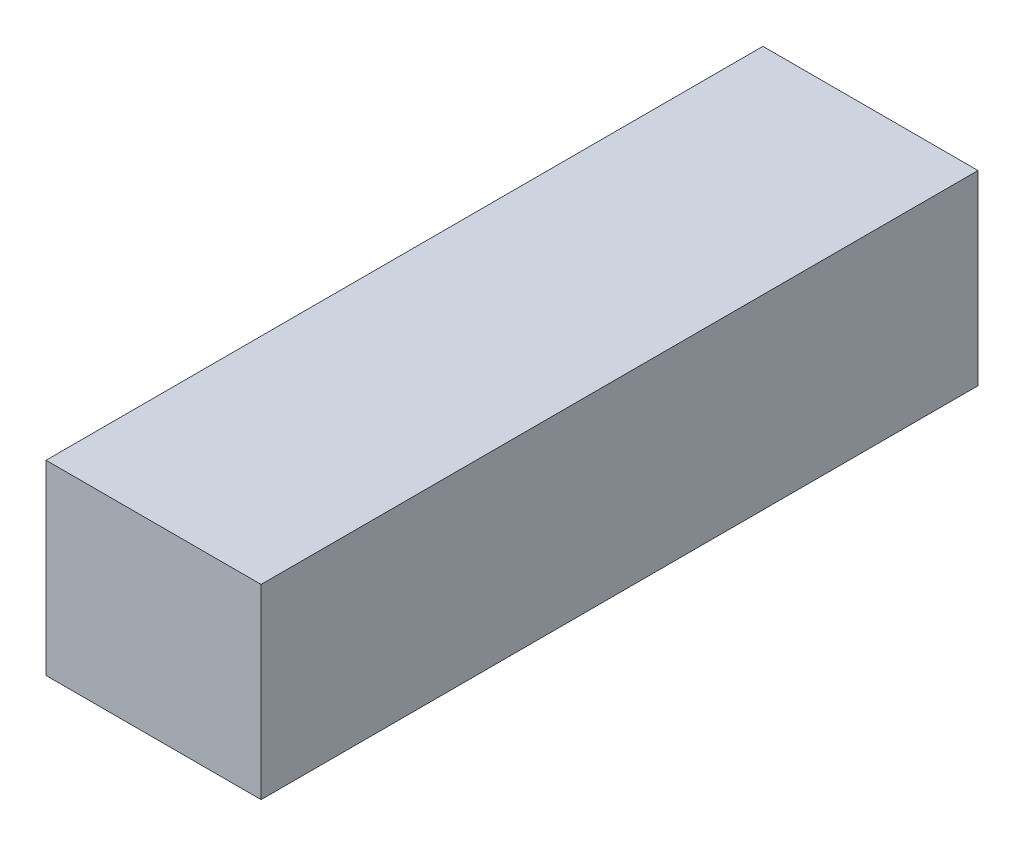
ISO-10303-21;
HEADER;
FILE_DESCRIPTION(('STEP AP214'),'2;1');
FILE_NAME('part.step','',(''),(''),'','','');
FILE_SCHEMA(('AUTOMOTIVE_DESIGN { 1 0 10303 214 1 1 1 1 }'));
ENDSEC;
DATA;
#1=APPLICATION_CONTEXT('core data for automotive mechanical design processes');
#2=APPLICATION_PROTOCOL_DEFINITION('international standard','automotive_design',2000,#1);
#3=PRODUCT_CONTEXT('',#1,'mechanical');
#4=PRODUCT('Part','Part','',(#3));
#5=PRODUCT_RELATED_PRODUCT_CATEGORY('part','',(#4));
#6=PRODUCT_DEFINITION_FORMATION('','',#4);
#7=PRODUCT_DEFINITION_CONTEXT('part definition',#1,'design');
#8=PRODUCT_DEFINITION('design','',#6,#7);
#9=PRODUCT_DEFINITION_SHAPE('','',#8);
#10=(LENGTH_UNIT() NAMED_UNIT(*) SI_UNIT(.MILLI.,.METRE.));
#11=(NAMED_UNIT(*) PLANE_ANGLE_UNIT() SI_UNIT($,.RADIAN.));
#12=(NAMED_UNIT(*) SI_UNIT($,.STERADIAN.) SOLID_ANGLE_UNIT());
#13=UNCERTAINTY_MEASURE_WITH_UNIT(LENGTH_MEASURE(1.E-05),#10,'distance_accuracy_value','');
#14=(GEOMETRIC_REPRESENTATION_CONTEXT(3) GLOBAL_UNCERTAINTY_ASSIGNED_CONTEXT((#13)) GLOBAL_UNIT_ASSIGNED_CONTEXT((#10,
#11,#12)) REPRESENTATION_CONTEXT('',''));
#15=CARTESIAN_POINT('',(0.,0.,0.));
#16=DIRECTION('',(0.,0.,1.));
#17=DIRECTION('',(1.,0.,0.));
#18=AXIS2_PLACEMENT_3D('',#15,#16,#17);
#19=CARTESIAN_POINT('',(0.,26.,0.));
#20=DIRECTION('',(1.,0.,0.));
#21=DIRECTION('',(0.,0.,-1.));
#22=AXIS2_PLACEMENT_3D('',#19,#20,#21);
#23=PLANE('',#22);
#24=DIRECTION('',(0.,0.,1.));
#25=VECTOR('',#24,1.);
#26=CARTESIAN_POINT('',(0.,0.,0.));
#27=LINE('',#26,#25);
#28=CARTESIAN_POINT('',(0.,0.,-100.));
#29=VERTEX_POINT('',#28);
#30=CARTESIAN_POINT('',(0.,0.,0.));
#31=VERTEX_POINT('',#30);
#32=EDGE_CURVE('E96',#29,#31,#27,.T.);
#33=ORIENTED_EDGE('',*,*,#32,.T.);
#34=DIRECTION('',(0.,-1.,0.));
#35=VECTOR('',#34,1.);
#36=CARTESIAN_POINT('',(0.,26.,0.));
#37=LINE('',#36,#35);
#38=CARTESIAN_POINT('',(0.,26.,0.));
#39=VERTEX_POINT('',#38);
#40=EDGE_CURVE('E11',#39,#31,#37,.T.);
#41=ORIENTED_EDGE('',*,*,#40,.F.);
#42=DIRECTION('',(0.,0.,1.));
#43=VECTOR('',#42,1.);
#44=CARTESIAN_POINT('',(0.,26.,0.));
#45=LINE('',#44,#43);
#46=CARTESIAN_POINT('',(0.,26.,-100.));
#47=VERTEX_POINT('',#46);
#48=EDGE_CURVE('E84',#47,#39,#45,.T.);
#49=ORIENTED_EDGE('',*,*,#48,.F.);
#50=DIRECTION('',(0.,-1.,0.));
#51=VECTOR('',#50,1.);
#52=CARTESIAN_POINT('',(0.,26.,-100.));
#53=LINE('',#52,#51);
#54=EDGE_CURVE('E92',#47,#29,#53,.T.);
#55=ORIENTED_EDGE('',*,*,#54,.T.);
#56=EDGE_LOOP('',(#33,#41,#49,#55));
#57=FACE_BOUND('',#56,.T.);
#58=ADVANCED_FACE('F33',(#57),#23,.F.);
#59=CARTESIAN_POINT('',(0.,26.,0.));
#60=DIRECTION('',(0.,0.,-1.));
#61=DIRECTION('',(-1.,0.,0.));
#62=AXIS2_PLACEMENT_3D('',#59,#60,#61);
#63=PLANE('',#62);
#64=DIRECTION('',(1.,0.,0.));
#65=VECTOR('',#64,1.);
#66=CARTESIAN_POINT('',(0.,0.,0.));
#67=LINE('',#66,#65);
#68=CARTESIAN_POINT('',(30.,0.,0.));
#69=VERTEX_POINT('',#68);
#70=EDGE_CURVE('E88',#31,#69,#67,.T.);
#71=ORIENTED_EDGE('',*,*,#70,.T.);
#72=DIRECTION('',(0.,-1.,0.));
#73=VECTOR('',#72,1.);
#74=CARTESIAN_POINT('',(30.,26.,0.));
#75=LINE('',#74,#73);
#76=CARTESIAN_POINT('',(30.,26.,0.));
#77=VERTEX_POINT('',#76);
#78=EDGE_CURVE('E41',#77,#69,#75,.T.);
#79=ORIENTED_EDGE('',*,*,#78,.F.);
#80=DIRECTION('',(1.,0.,0.));
#81=VECTOR('',#80,1.);
#82=CARTESIAN_POINT('',(0.,26.,0.));
#83=LINE('',#82,#81);
#84=EDGE_CURVE('E79',#39,#77,#83,.T.);
#85=ORIENTED_EDGE('',*,*,#84,.F.);
#86=ORIENTED_EDGE('',*,*,#40,.T.);
#87=EDGE_LOOP('',(#71,#79,#85,#86));
#88=FACE_BOUND('',#87,.T.);
#89=ADVANCED_FACE('F87',(#88),#63,.F.);
#90=CARTESIAN_POINT('',(30.,26.,0.));
#91=DIRECTION('',(-1.,0.,0.));
#92=DIRECTION('',(0.,0.,1.));
#93=AXIS2_PLACEMENT_3D('',#90,#91,#92);
#94=PLANE('',#93);
#95=DIRECTION('',(0.,0.,-1.));
#96=VECTOR('',#95,1.);
#97=CARTESIAN_POINT('',(30.,0.,0.));
#98=LINE('',#97,#96);
#99=CARTESIAN_POINT('',(30.,0.,-100.));
#100=VERTEX_POINT('',#99);
#101=EDGE_CURVE('E66',#69,#100,#98,.T.);
#102=ORIENTED_EDGE('',*,*,#101,.T.);
#103=DIRECTION('',(0.,-1.,0.));
#104=VECTOR('',#103,1.);
#105=CARTESIAN_POINT('',(30.,26.,-100.));
#106=LINE('',#105,#104);
#107=CARTESIAN_POINT('',(30.,26.,-100.));
#108=VERTEX_POINT('',#107);
#109=EDGE_CURVE('E89',#108,#100,#106,.T.);
#110=ORIENTED_EDGE('',*,*,#109,.F.);
#111=DIRECTION('',(0.,0.,-1.));
#112=VECTOR('',#111,1.);
#113=CARTESIAN_POINT('',(30.,26.,0.));
#114=LINE('',#113,#112);
#115=EDGE_CURVE('E82',#77,#108,#114,.T.);
#116=ORIENTED_EDGE('',*,*,#115,.F.);
#117=ORIENTED_EDGE('',*,*,#78,.T.);
#118=EDGE_LOOP('',(#102,#110,#116,#117));
#119=FACE_BOUND('',#118,.T.);
#120=ADVANCED_FACE('F90',(#119),#94,.F.);
#121=CARTESIAN_POINT('',(0.,26.,-100.));
#122=DIRECTION('',(0.,0.,1.));
#123=DIRECTION('',(1.,0.,0.));
#124=AXIS2_PLACEMENT_3D('',#121,#122,#123);
#125=PLANE('',#124);
#126=DIRECTION('',(-1.,0.,0.));
#127=VECTOR('',#126,1.);
#128=CARTESIAN_POINT('',(0.,0.,-100.));
#129=LINE('',#128,#127);
#130=EDGE_CURVE('E72',#100,#29,#129,.T.);
#131=ORIENTED_EDGE('',*,*,#130,.T.);
#132=ORIENTED_EDGE('',*,*,#54,.F.);
#133=DIRECTION('',(-1.,0.,0.));
#134=VECTOR('',#133,1.);
#135=CARTESIAN_POINT('',(0.,26.,-100.));
#136=LINE('',#135,#134);
#137=EDGE_CURVE('E49',#108,#47,#136,.T.);
#138=ORIENTED_EDGE('',*,*,#137,.F.);
#139=ORIENTED_EDGE('',*,*,#109,.T.);
#140=EDGE_LOOP('',(#131,#132,#138,#139));
#141=FACE_BOUND('',#140,.T.);
#142=ADVANCED_FACE('F103',(#141),#125,.F.);
#143=CARTESIAN_POINT('',(0.,26.,0.));
#144=DIRECTION('',(0.,-1.,0.));
#145=DIRECTION('',(0.,0.,-1.));
#146=AXIS2_PLACEMENT_3D('',#143,#144,#145);
#147=PLANE('',#146);
#148=ORIENTED_EDGE('',*,*,#48,.T.);
#149=ORIENTED_EDGE('',*,*,#84,.T.);
#150=ORIENTED_EDGE('',*,*,#115,.T.);
#151=ORIENTED_EDGE('',*,*,#137,.T.);
#152=EDGE_LOOP('',(#148,#149,#150,#151));
#153=FACE_BOUND('',#152,.T.);
#154=ADVANCED_FACE('F80',(#153),#147,.F.);
#155=CARTESIAN_POINT('',(0.,0.,0.));
#156=DIRECTION('',(0.,-1.,0.));
#157=DIRECTION('',(0.,0.,-1.));
#158=AXIS2_PLACEMENT_3D('',#155,#156,#157);
#159=PLANE('',#158);
#160=ORIENTED_EDGE('',*,*,#32,.F.);
#161=ORIENTED_EDGE('',*,*,#130,.F.);
#162=ORIENTED_EDGE('',*,*,#101,.F.);
#163=ORIENTED_EDGE('',*,*,#70,.F.);
#164=EDGE_LOOP('',(#160,#161,#162,#163));
#165=FACE_BOUND('',#164,.T.);
#166=ADVANCED_FACE('F106',(#165),#159,.T.);
#167=CLOSED_SHELL('',(#58,#89,#120,#142,#154,#166));
#168=MANIFOLD_SOLID_BREP('B2',#167);
#169=ADVANCED_BREP_SHAPE_REPRESENTATION('',(#18,#168),#14);
#170=SHAPE_DEFINITION_REPRESENTATION(#9,#169);
ENDSEC;
END-ISO-10303-21;
